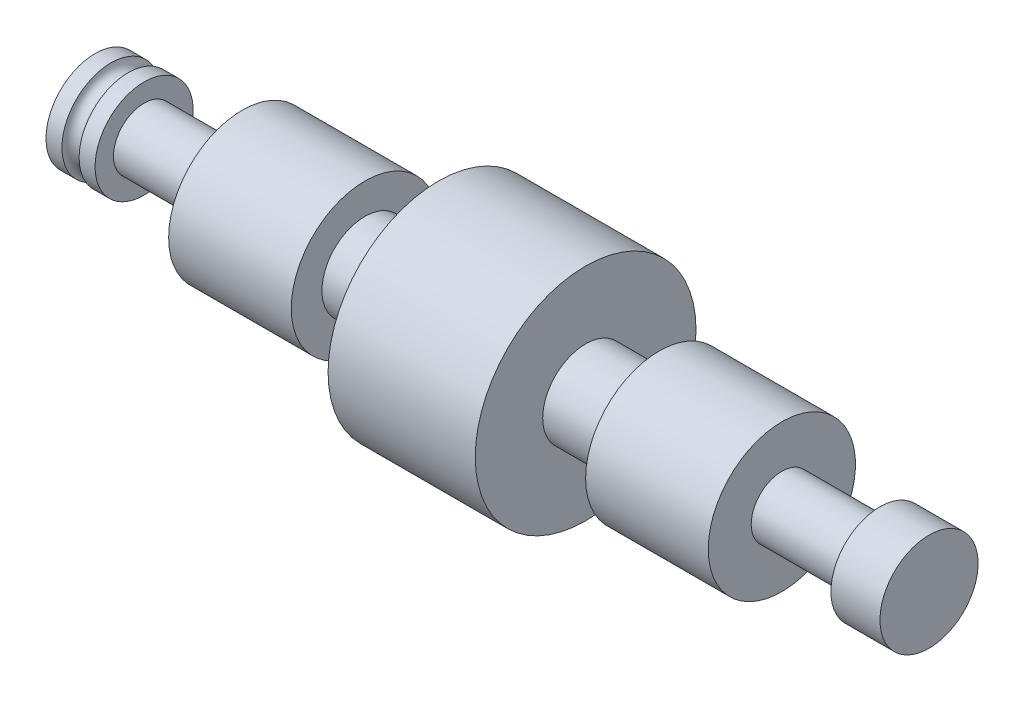
ISO-10303-21;
HEADER;
FILE_DESCRIPTION(('STEP AP214'),'2;1');
FILE_NAME('part.step','',(''),(''),'','','');
FILE_SCHEMA(('AUTOMOTIVE_DESIGN { 1 0 10303 214 1 1 1 1 }'));
ENDSEC;
DATA;
#1=APPLICATION_CONTEXT('core data for automotive mechanical design processes');
#2=APPLICATION_PROTOCOL_DEFINITION('international standard','automotive_design',2000,#1);
#3=PRODUCT_CONTEXT('',#1,'mechanical');
#4=PRODUCT('Part','Part','',(#3));
#5=PRODUCT_RELATED_PRODUCT_CATEGORY('part','',(#4));
#6=PRODUCT_DEFINITION_FORMATION('','',#4);
#7=PRODUCT_DEFINITION_CONTEXT('part definition',#1,'design');
#8=PRODUCT_DEFINITION('design','',#6,#7);
#9=PRODUCT_DEFINITION_SHAPE('','',#8);
#10=(LENGTH_UNIT() NAMED_UNIT(*) SI_UNIT(.MILLI.,.METRE.));
#11=(NAMED_UNIT(*) PLANE_ANGLE_UNIT() SI_UNIT($,.RADIAN.));
#12=(NAMED_UNIT(*) SI_UNIT($,.STERADIAN.) SOLID_ANGLE_UNIT());
#13=UNCERTAINTY_MEASURE_WITH_UNIT(LENGTH_MEASURE(1.E-05),#10,'distance_accuracy_value','');
#14=(GEOMETRIC_REPRESENTATION_CONTEXT(3) GLOBAL_UNCERTAINTY_ASSIGNED_CONTEXT((#13)) GLOBAL_UNIT_ASSIGNED_CONTEXT((#10,
#11,#12)) REPRESENTATION_CONTEXT('',''));
#15=CARTESIAN_POINT('',(0.,0.,0.));
#16=DIRECTION('',(0.,0.,1.));
#17=DIRECTION('',(1.,0.,0.));
#18=AXIS2_PLACEMENT_3D('',#15,#16,#17);
#19=CARTESIAN_POINT('',(-99.144385026738,0.,0.));
#20=DIRECTION('',(-1.,0.,0.));
#21=DIRECTION('',(0.,0.,1.));
#22=AXIS2_PLACEMENT_3D('',#19,#20,#21);
#23=CYLINDRICAL_SURFACE('',#22,20.);
#24=CARTESIAN_POINT('',(-150.,0.,0.));
#25=DIRECTION('',(-1.,0.,0.));
#26=DIRECTION('',(0.,0.,1.));
#27=AXIS2_PLACEMENT_3D('',#24,#25,#26);
#28=CIRCLE('',#27,20.);
#29=CARTESIAN_POINT('',(-150.,0.,20.));
#30=VERTEX_POINT('',#29);
#31=EDGE_CURVE('E46',#30,#30,#28,.T.);
#32=ORIENTED_EDGE('',*,*,#31,.T.);
#33=EDGE_LOOP('',(#32));
#34=FACE_BOUND('',#33,.T.);
#35=CARTESIAN_POINT('',(-156.502113115836,0.,0.));
#36=DIRECTION('',(-1.,0.,0.));
#37=DIRECTION('',(0.,0.,1.));
#38=AXIS2_PLACEMENT_3D('',#35,#36,#37);
#39=CIRCLE('',#38,20.);
#40=CARTESIAN_POINT('',(-156.502113115836,0.,20.));
#41=VERTEX_POINT('',#40);
#42=EDGE_CURVE('E55',#41,#41,#39,.T.);
#43=ORIENTED_EDGE('',*,*,#42,.F.);
#44=EDGE_LOOP('',(#43));
#45=FACE_BOUND('',#44,.T.);
#46=ADVANCED_FACE('F37',(#34,#45),#23,.T.);
#47=CARTESIAN_POINT('',(-150.,20.,0.));
#48=DIRECTION('',(-1.,0.,0.));
#49=DIRECTION('',(0.,0.,1.));
#50=AXIS2_PLACEMENT_3D('',#47,#48,#49);
#51=PLANE('',#50);
#52=ORIENTED_EDGE('',*,*,#31,.F.);
#53=EDGE_LOOP('',(#52));
#54=FACE_BOUND('',#53,.T.);
#55=CARTESIAN_POINT('',(-150.,0.,0.));
#56=DIRECTION('',(-1.,0.,0.));
#57=DIRECTION('',(0.,0.,1.));
#58=AXIS2_PLACEMENT_3D('',#55,#56,#57);
#59=CIRCLE('',#58,12.5);
#60=CARTESIAN_POINT('',(-150.,0.,12.5));
#61=VERTEX_POINT('',#60);
#62=EDGE_CURVE('E52',#61,#61,#59,.T.);
#63=ORIENTED_EDGE('',*,*,#62,.T.);
#64=EDGE_LOOP('',(#63));
#65=FACE_BOUND('',#64,.T.);
#66=ADVANCED_FACE('F102',(#54,#65),#51,.F.);
#67=CARTESIAN_POINT('',(-99.144385026738,0.,0.));
#68=DIRECTION('',(-1.,0.,0.));
#69=DIRECTION('',(0.,0.,1.));
#70=AXIS2_PLACEMENT_3D('',#67,#68,#69);
#71=CYLINDRICAL_SURFACE('',#70,12.5);
#72=ORIENTED_EDGE('',*,*,#62,.F.);
#73=EDGE_LOOP('',(#72));
#74=FACE_BOUND('',#73,.T.);
#75=CARTESIAN_POINT('',(-110.,0.,0.));
#76=DIRECTION('',(-1.,0.,0.));
#77=DIRECTION('',(0.,0.,1.));
#78=AXIS2_PLACEMENT_3D('',#75,#76,#77);
#79=CIRCLE('',#78,12.5);
#80=CARTESIAN_POINT('',(-110.,0.,12.5));
#81=VERTEX_POINT('',#80);
#82=EDGE_CURVE('E95',#81,#81,#79,.T.);
#83=ORIENTED_EDGE('',*,*,#82,.T.);
#84=EDGE_LOOP('',(#83));
#85=FACE_BOUND('',#84,.T.);
#86=ADVANCED_FACE('F104',(#74,#85),#71,.T.);
#87=CARTESIAN_POINT('',(-110.,12.5,0.));
#88=DIRECTION('',(1.,0.,0.));
#89=DIRECTION('',(0.,0.,-1.));
#90=AXIS2_PLACEMENT_3D('',#87,#88,#89);
#91=PLANE('',#90);
#92=ORIENTED_EDGE('',*,*,#82,.F.);
#93=EDGE_LOOP('',(#92));
#94=FACE_BOUND('',#93,.T.);
#95=CARTESIAN_POINT('',(-110.,0.,0.));
#96=DIRECTION('',(-1.,0.,0.));
#97=DIRECTION('',(0.,0.,1.));
#98=AXIS2_PLACEMENT_3D('',#95,#96,#97);
#99=CIRCLE('',#98,30.);
#100=CARTESIAN_POINT('',(-110.,0.,30.));
#101=VERTEX_POINT('',#100);
#102=EDGE_CURVE('E91',#101,#101,#99,.T.);
#103=ORIENTED_EDGE('',*,*,#102,.T.);
#104=EDGE_LOOP('',(#103));
#105=FACE_BOUND('',#104,.T.);
#106=ADVANCED_FACE('F107',(#94,#105),#91,.F.);
#107=CARTESIAN_POINT('',(-99.144385026738,0.,0.));
#108=DIRECTION('',(-1.,0.,0.));
#109=DIRECTION('',(0.,0.,1.));
#110=AXIS2_PLACEMENT_3D('',#107,#108,#109);
#111=CYLINDRICAL_SURFACE('',#110,30.);
#112=ORIENTED_EDGE('',*,*,#102,.F.);
#113=EDGE_LOOP('',(#112));
#114=FACE_BOUND('',#113,.T.);
#115=CARTESIAN_POINT('',(-60.,0.,0.));
#116=DIRECTION('',(-1.,0.,0.));
#117=DIRECTION('',(0.,0.,1.));
#118=AXIS2_PLACEMENT_3D('',#115,#116,#117);
#119=CIRCLE('',#118,30.);
#120=CARTESIAN_POINT('',(-60.,0.,30.));
#121=VERTEX_POINT('',#120);
#122=EDGE_CURVE('E87',#121,#121,#119,.T.);
#123=ORIENTED_EDGE('',*,*,#122,.T.);
#124=EDGE_LOOP('',(#123));
#125=FACE_BOUND('',#124,.T.);
#126=ADVANCED_FACE('F113',(#114,#125),#111,.T.);
#127=CARTESIAN_POINT('',(-60.,30.,0.));
#128=DIRECTION('',(-1.,0.,0.));
#129=DIRECTION('',(0.,0.,1.));
#130=AXIS2_PLACEMENT_3D('',#127,#128,#129);
#131=PLANE('',#130);
#132=ORIENTED_EDGE('',*,*,#122,.F.);
#133=EDGE_LOOP('',(#132));
#134=FACE_BOUND('',#133,.T.);
#135=CARTESIAN_POINT('',(-60.,0.,0.));
#136=DIRECTION('',(-1.,0.,0.));
#137=DIRECTION('',(0.,0.,1.));
#138=AXIS2_PLACEMENT_3D('',#135,#136,#137);
#139=CIRCLE('',#138,17.5);
#140=CARTESIAN_POINT('',(-60.,0.,17.5));
#141=VERTEX_POINT('',#140);
#142=EDGE_CURVE('E83',#141,#141,#139,.T.);
#143=ORIENTED_EDGE('',*,*,#142,.T.);
#144=EDGE_LOOP('',(#143));
#145=FACE_BOUND('',#144,.T.);
#146=ADVANCED_FACE('F119',(#134,#145),#131,.F.);
#147=CARTESIAN_POINT('',(-99.144385026738,0.,0.));
#148=DIRECTION('',(-1.,0.,0.));
#149=DIRECTION('',(0.,0.,1.));
#150=AXIS2_PLACEMENT_3D('',#147,#148,#149);
#151=CYLINDRICAL_SURFACE('',#150,17.5);
#152=ORIENTED_EDGE('',*,*,#142,.F.);
#153=EDGE_LOOP('',(#152));
#154=FACE_BOUND('',#153,.T.);
#155=CARTESIAN_POINT('',(-30.,0.,0.));
#156=DIRECTION('',(-1.,0.,0.));
#157=DIRECTION('',(0.,0.,1.));
#158=AXIS2_PLACEMENT_3D('',#155,#156,#157);
#159=CIRCLE('',#158,17.5);
#160=CARTESIAN_POINT('',(-30.,0.,17.5));
#161=VERTEX_POINT('',#160);
#162=EDGE_CURVE('E79',#161,#161,#159,.T.);
#163=ORIENTED_EDGE('',*,*,#162,.T.);
#164=EDGE_LOOP('',(#163));
#165=FACE_BOUND('',#164,.T.);
#166=ADVANCED_FACE('F125',(#154,#165),#151,.T.);
#167=CARTESIAN_POINT('',(-30.,17.5,0.));
#168=DIRECTION('',(1.,0.,0.));
#169=DIRECTION('',(0.,0.,-1.));
#170=AXIS2_PLACEMENT_3D('',#167,#168,#169);
#171=PLANE('',#170);
#172=ORIENTED_EDGE('',*,*,#162,.F.);
#173=EDGE_LOOP('',(#172));
#174=FACE_BOUND('',#173,.T.);
#175=CARTESIAN_POINT('',(-30.,0.,0.));
#176=DIRECTION('',(-1.,0.,0.));
#177=DIRECTION('',(0.,0.,1.));
#178=AXIS2_PLACEMENT_3D('',#175,#176,#177);
#179=CIRCLE('',#178,45.);
#180=CARTESIAN_POINT('',(-30.,0.,45.));
#181=VERTEX_POINT('',#180);
#182=EDGE_CURVE('E64',#181,#181,#179,.T.);
#183=ORIENTED_EDGE('',*,*,#182,.T.);
#184=EDGE_LOOP('',(#183));
#185=FACE_BOUND('',#184,.T.);
#186=ADVANCED_FACE('F131',(#174,#185),#171,.F.);
#187=CARTESIAN_POINT('',(-99.144385026738,0.,0.));
#188=DIRECTION('',(-1.,0.,0.));
#189=DIRECTION('',(0.,0.,1.));
#190=AXIS2_PLACEMENT_3D('',#187,#188,#189);
#191=CYLINDRICAL_SURFACE('',#190,45.);
#192=ORIENTED_EDGE('',*,*,#182,.F.);
#193=EDGE_LOOP('',(#192));
#194=FACE_BOUND('',#193,.T.);
#195=CARTESIAN_POINT('',(30.,0.,0.));
#196=DIRECTION('',(-1.,0.,0.));
#197=DIRECTION('',(0.,0.,1.));
#198=AXIS2_PLACEMENT_3D('',#195,#196,#197);
#199=CIRCLE('',#198,45.);
#200=CARTESIAN_POINT('',(30.,0.,45.));
#201=VERTEX_POINT('',#200);
#202=EDGE_CURVE('E147',#201,#201,#199,.T.);
#203=ORIENTED_EDGE('',*,*,#202,.T.);
#204=EDGE_LOOP('',(#203));
#205=FACE_BOUND('',#204,.T.);
#206=ADVANCED_FACE('F137',(#194,#205),#191,.T.);
#207=CARTESIAN_POINT('',(-160.,0.,0.));
#208=DIRECTION('',(-1.,0.,0.));
#209=DIRECTION('',(0.,0.,1.));
#210=AXIS2_PLACEMENT_3D('',#207,#208,#209);
#211=TOROIDAL_SURFACE('',#210,20.1216032301916,3.49999999999999);
#212=ORIENTED_EDGE('',*,*,#42,.T.);
#213=EDGE_LOOP('',(#212));
#214=FACE_BOUND('',#213,.T.);
#215=CARTESIAN_POINT('',(-163.497886884164,0.,0.));
#216=DIRECTION('',(1.,0.,0.));
#217=DIRECTION('',(0.,0.,-1.));
#218=AXIS2_PLACEMENT_3D('',#215,#216,#217);
#219=CIRCLE('',#218,20.);
#220=CARTESIAN_POINT('',(-163.497886884164,0.,-20.));
#221=VERTEX_POINT('',#220);
#222=EDGE_CURVE('E41',#221,#221,#219,.T.);
#223=ORIENTED_EDGE('',*,*,#222,.T.);
#224=EDGE_LOOP('',(#223));
#225=FACE_BOUND('',#224,.T.);
#226=ADVANCED_FACE('F143',(#214,#225),#211,.F.);
#227=CARTESIAN_POINT('',(-170.,0.,0.));
#228=DIRECTION('',(1.,0.,0.));
#229=DIRECTION('',(0.,0.,-1.));
#230=AXIS2_PLACEMENT_3D('',#227,#228,#229);
#231=PLANE('',#230);
#232=CARTESIAN_POINT('',(-170.,0.,0.));
#233=DIRECTION('',(-1.,0.,0.));
#234=DIRECTION('',(0.,0.,1.));
#235=AXIS2_PLACEMENT_3D('',#232,#233,#234);
#236=CIRCLE('',#235,20.);
#237=CARTESIAN_POINT('',(-170.,0.,20.));
#238=VERTEX_POINT('',#237);
#239=EDGE_CURVE('E10',#238,#238,#236,.T.);
#240=ORIENTED_EDGE('',*,*,#239,.T.);
#241=EDGE_LOOP('',(#240));
#242=FACE_BOUND('',#241,.T.);
#243=ADVANCED_FACE('F39',(#242),#231,.F.);
#244=ORIENTED_EDGE('',*,*,#239,.F.);
#245=EDGE_LOOP('',(#244));
#246=FACE_BOUND('',#245,.T.);
#247=ORIENTED_EDGE('',*,*,#222,.F.);
#248=EDGE_LOOP('',(#247));
#249=FACE_BOUND('',#248,.T.);
#250=ADVANCED_FACE('F193',(#246,#249),#23,.T.);
#251=CARTESIAN_POINT('',(170.,0.,0.));
#252=DIRECTION('',(-1.,0.,0.));
#253=DIRECTION('',(0.,0.,-1.));
#254=AXIS2_PLACEMENT_3D('',#251,#252,#253);
#255=PLANE('',#254);
#256=CARTESIAN_POINT('',(170.,0.,0.));
#257=DIRECTION('',(-1.,0.,0.));
#258=DIRECTION('',(0.,0.,1.));
#259=AXIS2_PLACEMENT_3D('',#256,#257,#258);
#260=CIRCLE('',#259,20.);
#261=CARTESIAN_POINT('',(170.,0.,20.));
#262=VERTEX_POINT('',#261);
#263=EDGE_CURVE('E58',#262,#262,#260,.T.);
#264=ORIENTED_EDGE('',*,*,#263,.F.);
#265=EDGE_LOOP('',(#264));
#266=FACE_BOUND('',#265,.T.);
#267=ADVANCED_FACE('F189',(#266),#255,.F.);
#268=CARTESIAN_POINT('',(99.144385026738,0.,0.));
#269=DIRECTION('',(1.,0.,0.));
#270=DIRECTION('',(0.,0.,1.));
#271=AXIS2_PLACEMENT_3D('',#268,#269,#270);
#272=CYLINDRICAL_SURFACE('',#271,20.);
#273=ORIENTED_EDGE('',*,*,#263,.T.);
#274=EDGE_LOOP('',(#273));
#275=FACE_BOUND('',#274,.T.);
#276=CARTESIAN_POINT('',(150.,0.,0.));
#277=DIRECTION('',(-1.,0.,0.));
#278=DIRECTION('',(0.,0.,1.));
#279=AXIS2_PLACEMENT_3D('',#276,#277,#278);
#280=CIRCLE('',#279,20.);
#281=CARTESIAN_POINT('',(150.,0.,20.));
#282=VERTEX_POINT('',#281);
#283=EDGE_CURVE('E66',#282,#282,#280,.T.);
#284=ORIENTED_EDGE('',*,*,#283,.F.);
#285=EDGE_LOOP('',(#284));
#286=FACE_BOUND('',#285,.T.);
#287=ADVANCED_FACE('F180',(#275,#286),#272,.T.);
#288=CARTESIAN_POINT('',(150.,20.,0.));
#289=DIRECTION('',(1.,0.,0.));
#290=DIRECTION('',(0.,0.,1.));
#291=AXIS2_PLACEMENT_3D('',#288,#289,#290);
#292=PLANE('',#291);
#293=ORIENTED_EDGE('',*,*,#283,.T.);
#294=EDGE_LOOP('',(#293));
#295=FACE_BOUND('',#294,.T.);
#296=CARTESIAN_POINT('',(150.,0.,0.));
#297=DIRECTION('',(-1.,0.,0.));
#298=DIRECTION('',(0.,0.,1.));
#299=AXIS2_PLACEMENT_3D('',#296,#297,#298);
#300=CIRCLE('',#299,12.5);
#301=CARTESIAN_POINT('',(150.,0.,12.5));
#302=VERTEX_POINT('',#301);
#303=EDGE_CURVE('E72',#302,#302,#300,.T.);
#304=ORIENTED_EDGE('',*,*,#303,.F.);
#305=EDGE_LOOP('',(#304));
#306=FACE_BOUND('',#305,.T.);
#307=ADVANCED_FACE('F178',(#295,#306),#292,.F.);
#308=CARTESIAN_POINT('',(99.144385026738,0.,0.));
#309=DIRECTION('',(1.,0.,0.));
#310=DIRECTION('',(0.,0.,1.));
#311=AXIS2_PLACEMENT_3D('',#308,#309,#310);
#312=CYLINDRICAL_SURFACE('',#311,12.5);
#313=ORIENTED_EDGE('',*,*,#303,.T.);
#314=EDGE_LOOP('',(#313));
#315=FACE_BOUND('',#314,.T.);
#316=CARTESIAN_POINT('',(110.,0.,0.));
#317=DIRECTION('',(-1.,0.,0.));
#318=DIRECTION('',(0.,0.,1.));
#319=AXIS2_PLACEMENT_3D('',#316,#317,#318);
#320=CIRCLE('',#319,12.5);
#321=CARTESIAN_POINT('',(110.,0.,12.5));
#322=VERTEX_POINT('',#321);
#323=EDGE_CURVE('E168',#322,#322,#320,.T.);
#324=ORIENTED_EDGE('',*,*,#323,.F.);
#325=EDGE_LOOP('',(#324));
#326=FACE_BOUND('',#325,.T.);
#327=ADVANCED_FACE('F175',(#315,#326),#312,.T.);
#328=CARTESIAN_POINT('',(110.,12.5,0.));
#329=DIRECTION('',(-1.,0.,0.));
#330=DIRECTION('',(0.,0.,-1.));
#331=AXIS2_PLACEMENT_3D('',#328,#329,#330);
#332=PLANE('',#331);
#333=ORIENTED_EDGE('',*,*,#323,.T.);
#334=EDGE_LOOP('',(#333));
#335=FACE_BOUND('',#334,.T.);
#336=CARTESIAN_POINT('',(110.,0.,0.));
#337=DIRECTION('',(-1.,0.,0.));
#338=DIRECTION('',(0.,0.,1.));
#339=AXIS2_PLACEMENT_3D('',#336,#337,#338);
#340=CIRCLE('',#339,30.);
#341=CARTESIAN_POINT('',(110.,0.,30.));
#342=VERTEX_POINT('',#341);
#343=EDGE_CURVE('E164',#342,#342,#340,.T.);
#344=ORIENTED_EDGE('',*,*,#343,.F.);
#345=EDGE_LOOP('',(#344));
#346=FACE_BOUND('',#345,.T.);
#347=ADVANCED_FACE('F187',(#335,#346),#332,.F.);
#348=CARTESIAN_POINT('',(99.144385026738,0.,0.));
#349=DIRECTION('',(1.,0.,0.));
#350=DIRECTION('',(0.,0.,1.));
#351=AXIS2_PLACEMENT_3D('',#348,#349,#350);
#352=CYLINDRICAL_SURFACE('',#351,30.);
#353=ORIENTED_EDGE('',*,*,#343,.T.);
#354=EDGE_LOOP('',(#353));
#355=FACE_BOUND('',#354,.T.);
#356=CARTESIAN_POINT('',(60.,0.,0.));
#357=DIRECTION('',(-1.,0.,0.));
#358=DIRECTION('',(0.,0.,1.));
#359=AXIS2_PLACEMENT_3D('',#356,#357,#358);
#360=CIRCLE('',#359,30.);
#361=CARTESIAN_POINT('',(60.,0.,30.));
#362=VERTEX_POINT('',#361);
#363=EDGE_CURVE('E160',#362,#362,#360,.T.);
#364=ORIENTED_EDGE('',*,*,#363,.F.);
#365=EDGE_LOOP('',(#364));
#366=FACE_BOUND('',#365,.T.);
#367=ADVANCED_FACE('F309',(#355,#366),#352,.T.);
#368=CARTESIAN_POINT('',(60.,30.,0.));
#369=DIRECTION('',(1.,0.,0.));
#370=DIRECTION('',(0.,0.,1.));
#371=AXIS2_PLACEMENT_3D('',#368,#369,#370);
#372=PLANE('',#371);
#373=ORIENTED_EDGE('',*,*,#363,.T.);
#374=EDGE_LOOP('',(#373));
#375=FACE_BOUND('',#374,.T.);
#376=CARTESIAN_POINT('',(60.,0.,0.));
#377=DIRECTION('',(-1.,0.,0.));
#378=DIRECTION('',(0.,0.,1.));
#379=AXIS2_PLACEMENT_3D('',#376,#377,#378);
#380=CIRCLE('',#379,17.5);
#381=CARTESIAN_POINT('',(60.,0.,17.5));
#382=VERTEX_POINT('',#381);
#383=EDGE_CURVE('E154',#382,#382,#380,.T.);
#384=ORIENTED_EDGE('',*,*,#383,.F.);
#385=EDGE_LOOP('',(#384));
#386=FACE_BOUND('',#385,.T.);
#387=ADVANCED_FACE('F318',(#375,#386),#372,.F.);
#388=CARTESIAN_POINT('',(99.144385026738,0.,0.));
#389=DIRECTION('',(1.,0.,0.));
#390=DIRECTION('',(0.,0.,1.));
#391=AXIS2_PLACEMENT_3D('',#388,#389,#390);
#392=CYLINDRICAL_SURFACE('',#391,17.5);
#393=ORIENTED_EDGE('',*,*,#383,.T.);
#394=EDGE_LOOP('',(#393));
#395=FACE_BOUND('',#394,.T.);
#396=CARTESIAN_POINT('',(30.,0.,0.));
#397=DIRECTION('',(-1.,0.,0.));
#398=DIRECTION('',(0.,0.,1.));
#399=AXIS2_PLACEMENT_3D('',#396,#397,#398);
#400=CIRCLE('',#399,17.5);
#401=CARTESIAN_POINT('',(30.,0.,17.5));
#402=VERTEX_POINT('',#401);
#403=EDGE_CURVE('E150',#402,#402,#400,.T.);
#404=ORIENTED_EDGE('',*,*,#403,.F.);
#405=EDGE_LOOP('',(#404));
#406=FACE_BOUND('',#405,.T.);
#407=ADVANCED_FACE('F327',(#395,#406),#392,.T.);
#408=CARTESIAN_POINT('',(30.,17.5,0.));
#409=DIRECTION('',(-1.,0.,0.));
#410=DIRECTION('',(0.,0.,-1.));
#411=AXIS2_PLACEMENT_3D('',#408,#409,#410);
#412=PLANE('',#411);
#413=ORIENTED_EDGE('',*,*,#403,.T.);
#414=EDGE_LOOP('',(#413));
#415=FACE_BOUND('',#414,.T.);
#416=ORIENTED_EDGE('',*,*,#202,.F.);
#417=EDGE_LOOP('',(#416));
#418=FACE_BOUND('',#417,.T.);
#419=ADVANCED_FACE('F336',(#415,#418),#412,.F.);
#420=CLOSED_SHELL('',(#46,#66,#86,#106,#126,#146,#166,#186,#206,#226,#243,#250,#267,#287,#307,
#327,#347,#367,#387,#407,#419));
#421=MANIFOLD_SOLID_BREP('B2',#420);
#422=ADVANCED_BREP_SHAPE_REPRESENTATION('',(#18,#421),#14);
#423=SHAPE_DEFINITION_REPRESENTATION(#9,#422);
ENDSEC;
END-ISO-10303-21;
